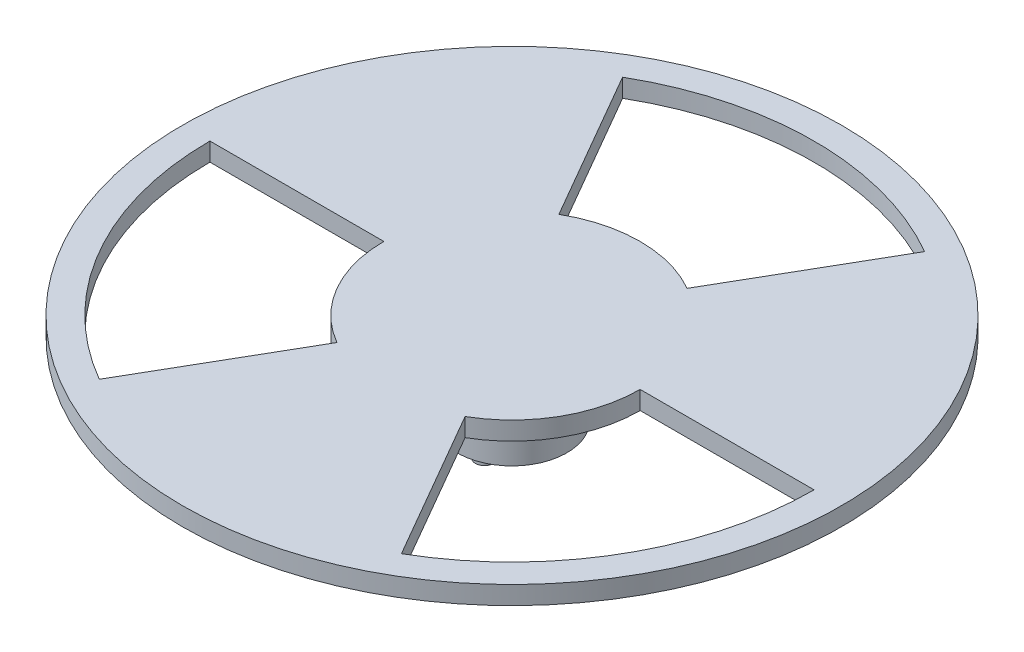
ISO-10303-21;
HEADER;
FILE_DESCRIPTION(('STEP AP214'),'2;1');
FILE_NAME('part.step','',(''),(''),'','','');
FILE_SCHEMA(('AUTOMOTIVE_DESIGN { 1 0 10303 214 1 1 1 1 }'));
ENDSEC;
DATA;
#1=APPLICATION_CONTEXT('core data for automotive mechanical design processes');
#2=APPLICATION_PROTOCOL_DEFINITION('international standard','automotive_design',2000,#1);
#3=PRODUCT_CONTEXT('',#1,'mechanical');
#4=PRODUCT('Part','Part','',(#3));
#5=PRODUCT_RELATED_PRODUCT_CATEGORY('part','',(#4));
#6=PRODUCT_DEFINITION_FORMATION('','',#4);
#7=PRODUCT_DEFINITION_CONTEXT('part definition',#1,'design');
#8=PRODUCT_DEFINITION('design','',#6,#7);
#9=PRODUCT_DEFINITION_SHAPE('','',#8);
#10=(LENGTH_UNIT() NAMED_UNIT(*) SI_UNIT(.MILLI.,.METRE.));
#11=(NAMED_UNIT(*) PLANE_ANGLE_UNIT() SI_UNIT($,.RADIAN.));
#12=(NAMED_UNIT(*) SI_UNIT($,.STERADIAN.) SOLID_ANGLE_UNIT());
#13=UNCERTAINTY_MEASURE_WITH_UNIT(LENGTH_MEASURE(1.E-05),#10,'distance_accuracy_value','');
#14=(GEOMETRIC_REPRESENTATION_CONTEXT(3) GLOBAL_UNCERTAINTY_ASSIGNED_CONTEXT((#13)) GLOBAL_UNIT_ASSIGNED_CONTEXT((#10,
#11,#12)) REPRESENTATION_CONTEXT('',''));
#15=CARTESIAN_POINT('',(0.,0.,0.));
#16=DIRECTION('',(0.,0.,1.));
#17=DIRECTION('',(1.,0.,0.));
#18=AXIS2_PLACEMENT_3D('',#15,#16,#17);
#19=CARTESIAN_POINT('',(0.,1.,0.));
#20=DIRECTION('',(0.,-1.,0.));
#21=DIRECTION('',(0.,0.,-1.));
#22=AXIS2_PLACEMENT_3D('',#19,#20,#21);
#23=CYLINDRICAL_SURFACE('',#22,18.);
#24=CARTESIAN_POINT('',(0.,1.,0.));
#25=DIRECTION('',(0.,1.,0.));
#26=DIRECTION('',(0.,0.,1.));
#27=AXIS2_PLACEMENT_3D('',#24,#25,#26);
#28=CIRCLE('',#27,18.);
#29=CARTESIAN_POINT('',(0.,1.,18.));
#30=VERTEX_POINT('',#29);
#31=EDGE_CURVE('E11',#30,#30,#28,.T.);
#32=ORIENTED_EDGE('',*,*,#31,.F.);
#33=EDGE_LOOP('',(#32));
#34=FACE_BOUND('',#33,.T.);
#35=CARTESIAN_POINT('',(0.,0.,0.));
#36=DIRECTION('',(0.,1.,0.));
#37=DIRECTION('',(0.,0.,1.));
#38=AXIS2_PLACEMENT_3D('',#35,#36,#37);
#39=CIRCLE('',#38,18.);
#40=CARTESIAN_POINT('',(0.,0.,18.));
#41=VERTEX_POINT('',#40);
#42=EDGE_CURVE('E45',#41,#41,#39,.T.);
#43=ORIENTED_EDGE('',*,*,#42,.T.);
#44=EDGE_LOOP('',(#43));
#45=FACE_BOUND('',#44,.T.);
#46=ADVANCED_FACE('F37',(#34,#45),#23,.T.);
#47=CARTESIAN_POINT('',(0.,1.,0.));
#48=DIRECTION('',(0.,1.,0.));
#49=DIRECTION('',(0.,0.,1.));
#50=AXIS2_PLACEMENT_3D('',#47,#48,#49);
#51=PLANE('',#50);
#52=CARTESIAN_POINT('',(0.,1.,0.));
#53=DIRECTION('',(0.,1.,0.));
#54=DIRECTION('',(0.,0.,-1.));
#55=AXIS2_PLACEMENT_3D('',#52,#53,#54);
#56=CIRCLE('',#55,16.5);
#57=CARTESIAN_POINT('',(8.25000000000002,1.,-14.2894191624432));
#58=VERTEX_POINT('',#57);
#59=CARTESIAN_POINT('',(-8.25000000000002,1.,-14.2894191624432));
#60=VERTEX_POINT('',#59);
#61=EDGE_CURVE('E53',#58,#60,#56,.T.);
#62=ORIENTED_EDGE('',*,*,#61,.F.);
#63=DIRECTION('',(0.500000000000001,0.,-0.866025403784438));
#64=VECTOR('',#63,1.);
#65=CARTESIAN_POINT('',(3.50000000000001,1.,-6.06217782649107));
#66=LINE('',#65,#64);
#67=CARTESIAN_POINT('',(3.50000000000001,1.,-6.06217782649107));
#68=VERTEX_POINT('',#67);
#69=EDGE_CURVE('E151',#68,#58,#66,.T.);
#70=ORIENTED_EDGE('',*,*,#69,.F.);
#71=CARTESIAN_POINT('',(0.,1.,0.));
#72=DIRECTION('',(0.,-1.,0.));
#73=DIRECTION('',(0.,0.,-1.));
#74=AXIS2_PLACEMENT_3D('',#71,#72,#73);
#75=CIRCLE('',#74,7.);
#76=CARTESIAN_POINT('',(-3.50000000000001,1.,-6.06217782649107));
#77=VERTEX_POINT('',#76);
#78=EDGE_CURVE('E134',#77,#68,#75,.T.);
#79=ORIENTED_EDGE('',*,*,#78,.F.);
#80=DIRECTION('',(0.500000000000001,0.,0.866025403784438));
#81=VECTOR('',#80,1.);
#82=CARTESIAN_POINT('',(-3.50000000000001,1.,-6.06217782649107));
#83=LINE('',#82,#81);
#84=EDGE_CURVE('E144',#60,#77,#83,.T.);
#85=ORIENTED_EDGE('',*,*,#84,.F.);
#86=EDGE_LOOP('',(#62,#70,#79,#85));
#87=FACE_BOUND('',#86,.T.);
#88=CARTESIAN_POINT('',(0.,1.,0.));
#89=DIRECTION('',(0.,1.,0.));
#90=DIRECTION('',(0.,0.,-1.));
#91=AXIS2_PLACEMENT_3D('',#88,#89,#90);
#92=CIRCLE('',#91,16.5);
#93=CARTESIAN_POINT('',(8.24999999999991,1.,14.2894191624433));
#94=VERTEX_POINT('',#93);
#95=CARTESIAN_POINT('',(16.5,1.,0.));
#96=VERTEX_POINT('',#95);
#97=EDGE_CURVE('E61',#94,#96,#92,.T.);
#98=ORIENTED_EDGE('',*,*,#97,.F.);
#99=DIRECTION('',(0.499999999999995,0.,0.866025403784442));
#100=VECTOR('',#99,1.);
#101=CARTESIAN_POINT('',(3.49999999999996,1.,6.06217782649109));
#102=LINE('',#101,#100);
#103=CARTESIAN_POINT('',(3.49999999999996,1.,6.06217782649109));
#104=VERTEX_POINT('',#103);
#105=EDGE_CURVE('E180',#104,#94,#102,.T.);
#106=ORIENTED_EDGE('',*,*,#105,.F.);
#107=CARTESIAN_POINT('',(0.,1.,0.));
#108=DIRECTION('',(0.,-1.,0.));
#109=DIRECTION('',(0.,0.,-1.));
#110=AXIS2_PLACEMENT_3D('',#107,#108,#109);
#111=CIRCLE('',#110,7.);
#112=CARTESIAN_POINT('',(7.,1.,0.));
#113=VERTEX_POINT('',#112);
#114=EDGE_CURVE('E177',#113,#104,#111,.T.);
#115=ORIENTED_EDGE('',*,*,#114,.F.);
#116=DIRECTION('',(-1.,0.,0.));
#117=VECTOR('',#116,1.);
#118=CARTESIAN_POINT('',(7.,1.,0.));
#119=LINE('',#118,#117);
#120=EDGE_CURVE('E173',#96,#113,#119,.T.);
#121=ORIENTED_EDGE('',*,*,#120,.F.);
#122=EDGE_LOOP('',(#98,#106,#115,#121));
#123=FACE_BOUND('',#122,.T.);
#124=CARTESIAN_POINT('',(0.,1.,0.));
#125=DIRECTION('',(0.,1.,0.));
#126=DIRECTION('',(0.,0.,-1.));
#127=AXIS2_PLACEMENT_3D('',#124,#125,#126);
#128=CIRCLE('',#127,16.5);
#129=CARTESIAN_POINT('',(-16.5,1.,-1.72604985859692E-13));
#130=VERTEX_POINT('',#129);
#131=CARTESIAN_POINT('',(-8.25000000000011,1.,14.2894191624432));
#132=VERTEX_POINT('',#131);
#133=EDGE_CURVE('E199',#130,#132,#128,.T.);
#134=ORIENTED_EDGE('',*,*,#133,.F.);
#135=DIRECTION('',(-1.,0.,0.));
#136=VECTOR('',#135,1.);
#137=CARTESIAN_POINT('',(-7.,1.,0.));
#138=LINE('',#137,#136);
#139=CARTESIAN_POINT('',(-7.,1.,0.));
#140=VERTEX_POINT('',#139);
#141=EDGE_CURVE('E207',#140,#130,#138,.T.);
#142=ORIENTED_EDGE('',*,*,#141,.F.);
#143=CARTESIAN_POINT('',(0.,1.,0.));
#144=DIRECTION('',(0.,-1.,0.));
#145=DIRECTION('',(0.,0.,-1.));
#146=AXIS2_PLACEMENT_3D('',#143,#144,#145);
#147=CIRCLE('',#146,7.);
#148=CARTESIAN_POINT('',(-3.50000000000005,1.,6.06217782649104));
#149=VERTEX_POINT('',#148);
#150=EDGE_CURVE('E204',#149,#140,#147,.T.);
#151=ORIENTED_EDGE('',*,*,#150,.F.);
#152=DIRECTION('',(0.500000000000007,0.,-0.866025403784435));
#153=VECTOR('',#152,1.);
#154=CARTESIAN_POINT('',(-3.50000000000005,1.,6.06217782649104));
#155=LINE('',#154,#153);
#156=EDGE_CURVE('E201',#132,#149,#155,.T.);
#157=ORIENTED_EDGE('',*,*,#156,.F.);
#158=EDGE_LOOP('',(#134,#142,#151,#157));
#159=FACE_BOUND('',#158,.T.);
#160=ORIENTED_EDGE('',*,*,#31,.T.);
#161=EDGE_LOOP('',(#160));
#162=FACE_BOUND('',#161,.T.);
#163=ADVANCED_FACE('F148',(#87,#123,#159,#162),#51,.T.);
#164=CARTESIAN_POINT('',(0.,0.,0.));
#165=DIRECTION('',(0.,1.,0.));
#166=DIRECTION('',(0.,0.,1.));
#167=AXIS2_PLACEMENT_3D('',#164,#165,#166);
#168=PLANE('',#167);
#169=CARTESIAN_POINT('',(0.,0.,0.));
#170=DIRECTION('',(0.,1.,0.));
#171=DIRECTION('',(0.,0.,1.));
#172=AXIS2_PLACEMENT_3D('',#169,#170,#171);
#173=CIRCLE('',#172,3.);
#174=CARTESIAN_POINT('',(0.,0.,3.));
#175=VERTEX_POINT('',#174);
#176=EDGE_CURVE('E40',#175,#175,#173,.T.);
#177=ORIENTED_EDGE('',*,*,#176,.T.);
#178=EDGE_LOOP('',(#177));
#179=FACE_BOUND('',#178,.T.);
#180=DIRECTION('',(-0.500000000000001,0.,0.866025403784438));
#181=VECTOR('',#180,1.);
#182=CARTESIAN_POINT('',(3.50000000000001,0.,-6.06217782649107));
#183=LINE('',#182,#181);
#184=CARTESIAN_POINT('',(8.25000000000002,0.,-14.2894191624432));
#185=VERTEX_POINT('',#184);
#186=CARTESIAN_POINT('',(3.50000000000001,0.,-6.06217782649107));
#187=VERTEX_POINT('',#186);
#188=EDGE_CURVE('E471',#185,#187,#183,.T.);
#189=ORIENTED_EDGE('',*,*,#188,.F.);
#190=CARTESIAN_POINT('',(0.,0.,0.));
#191=DIRECTION('',(0.,1.,0.));
#192=DIRECTION('',(0.,0.,1.));
#193=AXIS2_PLACEMENT_3D('',#190,#191,#192);
#194=CIRCLE('',#193,16.5);
#195=CARTESIAN_POINT('',(-8.25000000000002,0.,-14.2894191624432));
#196=VERTEX_POINT('',#195);
#197=EDGE_CURVE('E162',#196,#185,#194,.F.);
#198=ORIENTED_EDGE('',*,*,#197,.F.);
#199=DIRECTION('',(-0.500000000000001,0.,-0.866025403784438));
#200=VECTOR('',#199,1.);
#201=CARTESIAN_POINT('',(-3.50000000000001,0.,-6.06217782649107));
#202=LINE('',#201,#200);
#203=CARTESIAN_POINT('',(-3.50000000000001,0.,-6.06217782649107));
#204=VERTEX_POINT('',#203);
#205=EDGE_CURVE('E160',#204,#196,#202,.T.);
#206=ORIENTED_EDGE('',*,*,#205,.F.);
#207=CARTESIAN_POINT('',(0.,0.,0.));
#208=DIRECTION('',(0.,1.,0.));
#209=DIRECTION('',(0.,0.,1.));
#210=AXIS2_PLACEMENT_3D('',#207,#208,#209);
#211=CIRCLE('',#210,7.);
#212=EDGE_CURVE('E137',#187,#204,#211,.T.);
#213=ORIENTED_EDGE('',*,*,#212,.F.);
#214=EDGE_LOOP('',(#189,#198,#206,#213));
#215=FACE_BOUND('',#214,.T.);
#216=DIRECTION('',(-0.499999999999995,0.,-0.866025403784442));
#217=VECTOR('',#216,1.);
#218=CARTESIAN_POINT('',(3.49999999999996,0.,6.06217782649109));
#219=LINE('',#218,#217);
#220=CARTESIAN_POINT('',(8.24999999999991,0.,14.2894191624433));
#221=VERTEX_POINT('',#220);
#222=CARTESIAN_POINT('',(3.49999999999996,0.,6.06217782649109));
#223=VERTEX_POINT('',#222);
#224=EDGE_CURVE('E166',#221,#223,#219,.T.);
#225=ORIENTED_EDGE('',*,*,#224,.F.);
#226=CARTESIAN_POINT('',(0.,0.,0.));
#227=DIRECTION('',(0.,1.,0.));
#228=DIRECTION('',(0.,0.,1.));
#229=AXIS2_PLACEMENT_3D('',#226,#227,#228);
#230=CIRCLE('',#229,16.5);
#231=CARTESIAN_POINT('',(16.5,0.,0.));
#232=VERTEX_POINT('',#231);
#233=EDGE_CURVE('E169',#232,#221,#230,.F.);
#234=ORIENTED_EDGE('',*,*,#233,.F.);
#235=DIRECTION('',(1.,0.,0.));
#236=VECTOR('',#235,1.);
#237=CARTESIAN_POINT('',(7.,0.,0.));
#238=LINE('',#237,#236);
#239=CARTESIAN_POINT('',(7.,0.,0.));
#240=VERTEX_POINT('',#239);
#241=EDGE_CURVE('E171',#240,#232,#238,.T.);
#242=ORIENTED_EDGE('',*,*,#241,.F.);
#243=CARTESIAN_POINT('',(0.,0.,0.));
#244=DIRECTION('',(0.,1.,0.));
#245=DIRECTION('',(0.,0.,1.));
#246=AXIS2_PLACEMENT_3D('',#243,#244,#245);
#247=CIRCLE('',#246,7.);
#248=EDGE_CURVE('E163',#223,#240,#247,.T.);
#249=ORIENTED_EDGE('',*,*,#248,.F.);
#250=EDGE_LOOP('',(#225,#234,#242,#249));
#251=FACE_BOUND('',#250,.T.);
#252=DIRECTION('',(1.,0.,0.));
#253=VECTOR('',#252,1.);
#254=CARTESIAN_POINT('',(-7.,0.,0.));
#255=LINE('',#254,#253);
#256=CARTESIAN_POINT('',(-16.5,0.,-1.72604985859692E-13));
#257=VERTEX_POINT('',#256);
#258=CARTESIAN_POINT('',(-7.,0.,0.));
#259=VERTEX_POINT('',#258);
#260=EDGE_CURVE('E194',#257,#259,#255,.T.);
#261=ORIENTED_EDGE('',*,*,#260,.F.);
#262=CARTESIAN_POINT('',(0.,0.,0.));
#263=DIRECTION('',(0.,1.,0.));
#264=DIRECTION('',(0.,0.,1.));
#265=AXIS2_PLACEMENT_3D('',#262,#263,#264);
#266=CIRCLE('',#265,16.5);
#267=CARTESIAN_POINT('',(-8.25000000000011,0.,14.2894191624432));
#268=VERTEX_POINT('',#267);
#269=EDGE_CURVE('E197',#268,#257,#266,.F.);
#270=ORIENTED_EDGE('',*,*,#269,.F.);
#271=DIRECTION('',(-0.500000000000007,0.,0.866025403784435));
#272=VECTOR('',#271,1.);
#273=CARTESIAN_POINT('',(-3.50000000000005,0.,6.06217782649104));
#274=LINE('',#273,#272);
#275=CARTESIAN_POINT('',(-3.50000000000005,0.,6.06217782649104));
#276=VERTEX_POINT('',#275);
#277=EDGE_CURVE('E174',#276,#268,#274,.T.);
#278=ORIENTED_EDGE('',*,*,#277,.F.);
#279=CARTESIAN_POINT('',(0.,0.,0.));
#280=DIRECTION('',(0.,1.,0.));
#281=DIRECTION('',(0.,0.,1.));
#282=AXIS2_PLACEMENT_3D('',#279,#280,#281);
#283=CIRCLE('',#282,7.);
#284=EDGE_CURVE('E191',#259,#276,#283,.T.);
#285=ORIENTED_EDGE('',*,*,#284,.F.);
#286=EDGE_LOOP('',(#261,#270,#278,#285));
#287=FACE_BOUND('',#286,.T.);
#288=ORIENTED_EDGE('',*,*,#42,.F.);
#289=EDGE_LOOP('',(#288));
#290=FACE_BOUND('',#289,.T.);
#291=ADVANCED_FACE('F222',(#179,#215,#251,#287,#290),#168,.F.);
#292=CARTESIAN_POINT('',(0.,-19.5242959341892,0.));
#293=DIRECTION('',(0.,1.,0.));
#294=DIRECTION('',(0.,0.,1.));
#295=AXIS2_PLACEMENT_3D('',#292,#293,#294);
#296=CYLINDRICAL_SURFACE('',#295,16.5);
#297=ORIENTED_EDGE('',*,*,#269,.T.);
#298=DIRECTION('',(0.,1.,0.));
#299=VECTOR('',#298,1.);
#300=CARTESIAN_POINT('',(-16.5,-19.5242959341892,-1.72604985859692E-13));
#301=LINE('',#300,#299);
#302=EDGE_CURVE('E195',#257,#130,#301,.T.);
#303=ORIENTED_EDGE('',*,*,#302,.T.);
#304=ORIENTED_EDGE('',*,*,#133,.T.);
#305=DIRECTION('',(0.,1.,0.));
#306=VECTOR('',#305,1.);
#307=CARTESIAN_POINT('',(-8.25000000000011,-19.5242959341892,14.2894191624432));
#308=LINE('',#307,#306);
#309=EDGE_CURVE('E210',#268,#132,#308,.T.);
#310=ORIENTED_EDGE('',*,*,#309,.F.);
#311=EDGE_LOOP('',(#297,#303,#304,#310));
#312=FACE_BOUND('',#311,.T.);
#313=ADVANCED_FACE('F224',(#312),#296,.F.);
#314=CARTESIAN_POINT('',(-7.,-19.5242959341892,0.));
#315=DIRECTION('',(0.,0.,-1.));
#316=DIRECTION('',(-1.,0.,0.));
#317=AXIS2_PLACEMENT_3D('',#314,#315,#316);
#318=PLANE('',#317);
#319=ORIENTED_EDGE('',*,*,#260,.T.);
#320=DIRECTION('',(0.,1.,0.));
#321=VECTOR('',#320,1.);
#322=CARTESIAN_POINT('',(-7.,-19.5242959341892,0.));
#323=LINE('',#322,#321);
#324=EDGE_CURVE('E212',#259,#140,#323,.T.);
#325=ORIENTED_EDGE('',*,*,#324,.T.);
#326=ORIENTED_EDGE('',*,*,#141,.T.);
#327=ORIENTED_EDGE('',*,*,#302,.F.);
#328=EDGE_LOOP('',(#319,#325,#326,#327));
#329=FACE_BOUND('',#328,.T.);
#330=ADVANCED_FACE('F230',(#329),#318,.F.);
#331=CARTESIAN_POINT('',(0.,-19.5242959341892,0.));
#332=DIRECTION('',(0.,1.,0.));
#333=DIRECTION('',(0.,0.,1.));
#334=AXIS2_PLACEMENT_3D('',#331,#332,#333);
#335=CYLINDRICAL_SURFACE('',#334,7.);
#336=ORIENTED_EDGE('',*,*,#284,.T.);
#337=DIRECTION('',(0.,1.,0.));
#338=VECTOR('',#337,1.);
#339=CARTESIAN_POINT('',(-3.50000000000005,-19.5242959341892,6.06217782649104));
#340=LINE('',#339,#338);
#341=EDGE_CURVE('E214',#276,#149,#340,.T.);
#342=ORIENTED_EDGE('',*,*,#341,.T.);
#343=ORIENTED_EDGE('',*,*,#150,.T.);
#344=ORIENTED_EDGE('',*,*,#324,.F.);
#345=EDGE_LOOP('',(#336,#342,#343,#344));
#346=FACE_BOUND('',#345,.T.);
#347=ADVANCED_FACE('F372',(#346),#335,.T.);
#348=CARTESIAN_POINT('',(-3.50000000000005,-19.5242959341892,6.06217782649104));
#349=DIRECTION('',(0.866025403784435,0.,0.500000000000007));
#350=DIRECTION('',(0.500000000000007,0.,-0.866025403784435));
#351=AXIS2_PLACEMENT_3D('',#348,#349,#350);
#352=PLANE('',#351);
#353=ORIENTED_EDGE('',*,*,#277,.T.);
#354=ORIENTED_EDGE('',*,*,#309,.T.);
#355=ORIENTED_EDGE('',*,*,#156,.T.);
#356=ORIENTED_EDGE('',*,*,#341,.F.);
#357=EDGE_LOOP('',(#353,#354,#355,#356));
#358=FACE_BOUND('',#357,.T.);
#359=ADVANCED_FACE('F369',(#358),#352,.F.);
#360=CARTESIAN_POINT('',(0.,-19.5242959341892,0.));
#361=DIRECTION('',(0.,1.,0.));
#362=DIRECTION('',(0.,0.,1.));
#363=AXIS2_PLACEMENT_3D('',#360,#361,#362);
#364=CYLINDRICAL_SURFACE('',#363,16.5);
#365=ORIENTED_EDGE('',*,*,#233,.T.);
#366=DIRECTION('',(0.,1.,0.));
#367=VECTOR('',#366,1.);
#368=CARTESIAN_POINT('',(8.24999999999991,-19.5242959341892,14.2894191624433));
#369=LINE('',#368,#367);
#370=EDGE_CURVE('E167',#221,#94,#369,.T.);
#371=ORIENTED_EDGE('',*,*,#370,.T.);
#372=ORIENTED_EDGE('',*,*,#97,.T.);
#373=DIRECTION('',(0.,1.,0.));
#374=VECTOR('',#373,1.);
#375=CARTESIAN_POINT('',(16.5,-19.5242959341892,0.));
#376=LINE('',#375,#374);
#377=EDGE_CURVE('E183',#232,#96,#376,.T.);
#378=ORIENTED_EDGE('',*,*,#377,.F.);
#379=EDGE_LOOP('',(#365,#371,#372,#378));
#380=FACE_BOUND('',#379,.T.);
#381=ADVANCED_FACE('F359',(#380),#364,.F.);
#382=CARTESIAN_POINT('',(3.49999999999996,-19.5242959341892,6.06217782649109));
#383=DIRECTION('',(-0.866025403784442,0.,0.499999999999995));
#384=DIRECTION('',(0.499999999999995,0.,0.866025403784442));
#385=AXIS2_PLACEMENT_3D('',#382,#383,#384);
#386=PLANE('',#385);
#387=ORIENTED_EDGE('',*,*,#224,.T.);
#388=DIRECTION('',(0.,1.,0.));
#389=VECTOR('',#388,1.);
#390=CARTESIAN_POINT('',(3.49999999999996,-19.5242959341892,6.06217782649109));
#391=LINE('',#390,#389);
#392=EDGE_CURVE('E185',#223,#104,#391,.T.);
#393=ORIENTED_EDGE('',*,*,#392,.T.);
#394=ORIENTED_EDGE('',*,*,#105,.T.);
#395=ORIENTED_EDGE('',*,*,#370,.F.);
#396=EDGE_LOOP('',(#387,#393,#394,#395));
#397=FACE_BOUND('',#396,.T.);
#398=ADVANCED_FACE('F355',(#397),#386,.F.);
#399=CARTESIAN_POINT('',(0.,-19.5242959341892,0.));
#400=DIRECTION('',(0.,1.,0.));
#401=DIRECTION('',(0.,0.,1.));
#402=AXIS2_PLACEMENT_3D('',#399,#400,#401);
#403=CYLINDRICAL_SURFACE('',#402,7.);
#404=ORIENTED_EDGE('',*,*,#248,.T.);
#405=DIRECTION('',(0.,1.,0.));
#406=VECTOR('',#405,1.);
#407=CARTESIAN_POINT('',(7.,-19.5242959341892,0.));
#408=LINE('',#407,#406);
#409=EDGE_CURVE('E187',#240,#113,#408,.T.);
#410=ORIENTED_EDGE('',*,*,#409,.T.);
#411=ORIENTED_EDGE('',*,*,#114,.T.);
#412=ORIENTED_EDGE('',*,*,#392,.F.);
#413=EDGE_LOOP('',(#404,#410,#411,#412));
#414=FACE_BOUND('',#413,.T.);
#415=ADVANCED_FACE('F358',(#414),#403,.T.);
#416=CARTESIAN_POINT('',(7.,-19.5242959341892,0.));
#417=DIRECTION('',(0.,0.,-1.));
#418=DIRECTION('',(-1.,0.,0.));
#419=AXIS2_PLACEMENT_3D('',#416,#417,#418);
#420=PLANE('',#419);
#421=ORIENTED_EDGE('',*,*,#241,.T.);
#422=ORIENTED_EDGE('',*,*,#377,.T.);
#423=ORIENTED_EDGE('',*,*,#120,.T.);
#424=ORIENTED_EDGE('',*,*,#409,.F.);
#425=EDGE_LOOP('',(#421,#422,#423,#424));
#426=FACE_BOUND('',#425,.T.);
#427=ADVANCED_FACE('F354',(#426),#420,.F.);
#428=CARTESIAN_POINT('',(0.,-19.5242959341892,0.));
#429=DIRECTION('',(0.,1.,0.));
#430=DIRECTION('',(0.,0.,1.));
#431=AXIS2_PLACEMENT_3D('',#428,#429,#430);
#432=CYLINDRICAL_SURFACE('',#431,16.5);
#433=ORIENTED_EDGE('',*,*,#197,.T.);
#434=DIRECTION('',(0.,1.,0.));
#435=VECTOR('',#434,1.);
#436=CARTESIAN_POINT('',(8.25000000000002,-19.5242959341892,-14.2894191624432));
#437=LINE('',#436,#435);
#438=EDGE_CURVE('E156',#185,#58,#437,.T.);
#439=ORIENTED_EDGE('',*,*,#438,.T.);
#440=ORIENTED_EDGE('',*,*,#61,.T.);
#441=DIRECTION('',(0.,1.,0.));
#442=VECTOR('',#441,1.);
#443=CARTESIAN_POINT('',(-8.25000000000002,-19.5242959341892,-14.2894191624432));
#444=LINE('',#443,#442);
#445=EDGE_CURVE('E141',#196,#60,#444,.T.);
#446=ORIENTED_EDGE('',*,*,#445,.F.);
#447=EDGE_LOOP('',(#433,#439,#440,#446));
#448=FACE_BOUND('',#447,.T.);
#449=ADVANCED_FACE('F347',(#448),#432,.F.);
#450=CARTESIAN_POINT('',(3.50000000000001,-19.5242959341892,-6.06217782649107));
#451=DIRECTION('',(0.866025403784438,0.,0.500000000000001));
#452=DIRECTION('',(0.500000000000001,0.,-0.866025403784438));
#453=AXIS2_PLACEMENT_3D('',#450,#451,#452);
#454=PLANE('',#453);
#455=ORIENTED_EDGE('',*,*,#188,.T.);
#456=DIRECTION('',(0.,1.,0.));
#457=VECTOR('',#456,1.);
#458=CARTESIAN_POINT('',(3.50000000000001,-19.5242959341892,-6.06217782649107));
#459=LINE('',#458,#457);
#460=EDGE_CURVE('E140',#187,#68,#459,.T.);
#461=ORIENTED_EDGE('',*,*,#460,.T.);
#462=ORIENTED_EDGE('',*,*,#69,.T.);
#463=ORIENTED_EDGE('',*,*,#438,.F.);
#464=EDGE_LOOP('',(#455,#461,#462,#463));
#465=FACE_BOUND('',#464,.T.);
#466=ADVANCED_FACE('F344',(#465),#454,.F.);
#467=CARTESIAN_POINT('',(0.,-19.5242959341892,0.));
#468=DIRECTION('',(0.,1.,0.));
#469=DIRECTION('',(0.,0.,1.));
#470=AXIS2_PLACEMENT_3D('',#467,#468,#469);
#471=CYLINDRICAL_SURFACE('',#470,7.);
#472=ORIENTED_EDGE('',*,*,#212,.T.);
#473=DIRECTION('',(0.,1.,0.));
#474=VECTOR('',#473,1.);
#475=CARTESIAN_POINT('',(-3.50000000000001,-19.5242959341892,-6.06217782649107));
#476=LINE('',#475,#474);
#477=EDGE_CURVE('E129',#204,#77,#476,.T.);
#478=ORIENTED_EDGE('',*,*,#477,.T.);
#479=ORIENTED_EDGE('',*,*,#78,.T.);
#480=ORIENTED_EDGE('',*,*,#460,.F.);
#481=EDGE_LOOP('',(#472,#478,#479,#480));
#482=FACE_BOUND('',#481,.T.);
#483=ADVANCED_FACE('F131',(#482),#471,.T.);
#484=CARTESIAN_POINT('',(-3.50000000000001,-19.5242959341892,-6.06217782649107));
#485=DIRECTION('',(-0.866025403784438,0.,0.500000000000001));
#486=DIRECTION('',(0.500000000000001,0.,0.866025403784438));
#487=AXIS2_PLACEMENT_3D('',#484,#485,#486);
#488=PLANE('',#487);
#489=ORIENTED_EDGE('',*,*,#205,.T.);
#490=ORIENTED_EDGE('',*,*,#445,.T.);
#491=ORIENTED_EDGE('',*,*,#84,.T.);
#492=ORIENTED_EDGE('',*,*,#477,.F.);
#493=EDGE_LOOP('',(#489,#490,#491,#492));
#494=FACE_BOUND('',#493,.T.);
#495=ADVANCED_FACE('F145',(#494),#488,.F.);
#496=CARTESIAN_POINT('',(0.,9.48528137423857,0.));
#497=DIRECTION('',(0.,-1.,0.));
#498=DIRECTION('',(0.,0.,-1.));
#499=AXIS2_PLACEMENT_3D('',#496,#497,#498);
#500=CYLINDRICAL_SURFACE('',#499,3.);
#501=CARTESIAN_POINT('',(0.,-4.,0.));
#502=DIRECTION('',(0.,-1.,0.));
#503=DIRECTION('',(0.,0.,-1.));
#504=AXIS2_PLACEMENT_3D('',#501,#502,#503);
#505=CIRCLE('',#504,3.);
#506=CARTESIAN_POINT('',(0.,-4.,-3.));
#507=VERTEX_POINT('',#506);
#508=EDGE_CURVE('E476',#507,#507,#505,.T.);
#509=ORIENTED_EDGE('',*,*,#508,.F.);
#510=EDGE_LOOP('',(#509));
#511=FACE_BOUND('',#510,.T.);
#512=ORIENTED_EDGE('',*,*,#176,.F.);
#513=EDGE_LOOP('',(#512));
#514=FACE_BOUND('',#513,.T.);
#515=ADVANCED_FACE('F264',(#511,#514),#500,.T.);
#516=CARTESIAN_POINT('',(0.,-4.,0.));
#517=DIRECTION('',(0.,-1.,0.));
#518=DIRECTION('',(0.,0.,-1.));
#519=AXIS2_PLACEMENT_3D('',#516,#517,#518);
#520=PLANE('',#519);
#521=CARTESIAN_POINT('',(1.29903810567665,-4.,-0.750000000000006));
#522=DIRECTION('',(0.,-1.,0.));
#523=DIRECTION('',(0.,0.,-1.));
#524=AXIS2_PLACEMENT_3D('',#521,#522,#523);
#525=CIRCLE('',#524,0.5);
#526=CARTESIAN_POINT('',(1.29903810567665,-4.,-1.25000000000001));
#527=VERTEX_POINT('',#526);
#528=EDGE_CURVE('E489',#527,#527,#525,.T.);
#529=ORIENTED_EDGE('',*,*,#528,.F.);
#530=EDGE_LOOP('',(#529));
#531=FACE_BOUND('',#530,.T.);
#532=CARTESIAN_POINT('',(-1.29903810567667,-4.,-0.75));
#533=DIRECTION('',(0.,-1.,0.));
#534=DIRECTION('',(0.,0.,-1.));
#535=AXIS2_PLACEMENT_3D('',#532,#533,#534);
#536=CIRCLE('',#535,0.5);
#537=CARTESIAN_POINT('',(-1.29903810567667,-4.,-1.25));
#538=VERTEX_POINT('',#537);
#539=EDGE_CURVE('E483',#538,#538,#536,.T.);
#540=ORIENTED_EDGE('',*,*,#539,.F.);
#541=EDGE_LOOP('',(#540));
#542=FACE_BOUND('',#541,.T.);
#543=CARTESIAN_POINT('',(0.,-4.,1.5));
#544=DIRECTION('',(0.,-1.,0.));
#545=DIRECTION('',(0.,0.,-1.));
#546=AXIS2_PLACEMENT_3D('',#543,#544,#545);
#547=CIRCLE('',#546,0.5);
#548=CARTESIAN_POINT('',(0.,-4.,1.));
#549=VERTEX_POINT('',#548);
#550=EDGE_CURVE('E480',#549,#549,#547,.T.);
#551=ORIENTED_EDGE('',*,*,#550,.F.);
#552=EDGE_LOOP('',(#551));
#553=FACE_BOUND('',#552,.T.);
#554=ORIENTED_EDGE('',*,*,#508,.T.);
#555=EDGE_LOOP('',(#554));
#556=FACE_BOUND('',#555,.T.);
#557=ADVANCED_FACE('F268',(#531,#542,#553,#556),#520,.T.);
#558=CARTESIAN_POINT('',(0.,-5.,1.5));
#559=DIRECTION('',(0.,1.,0.));
#560=DIRECTION('',(0.,0.,1.));
#561=AXIS2_PLACEMENT_3D('',#558,#559,#560);
#562=CYLINDRICAL_SURFACE('',#561,0.5);
#563=CARTESIAN_POINT('',(0.,-5.,1.5));
#564=DIRECTION('',(0.,-1.,0.));
#565=DIRECTION('',(0.,0.,-1.));
#566=AXIS2_PLACEMENT_3D('',#563,#564,#565);
#567=CIRCLE('',#566,0.5);
#568=CARTESIAN_POINT('',(0.,-5.,1.));
#569=VERTEX_POINT('',#568);
#570=EDGE_CURVE('E479',#569,#569,#567,.T.);
#571=ORIENTED_EDGE('',*,*,#570,.F.);
#572=EDGE_LOOP('',(#571));
#573=FACE_BOUND('',#572,.T.);
#574=ORIENTED_EDGE('',*,*,#550,.T.);
#575=EDGE_LOOP('',(#574));
#576=FACE_BOUND('',#575,.T.);
#577=ADVANCED_FACE('F278',(#573,#576),#562,.T.);
#578=CARTESIAN_POINT('',(0.,-5.,1.5));
#579=DIRECTION('',(0.,-1.,0.));
#580=DIRECTION('',(0.,0.,-1.));
#581=AXIS2_PLACEMENT_3D('',#578,#579,#580);
#582=PLANE('',#581);
#583=ORIENTED_EDGE('',*,*,#570,.T.);
#584=EDGE_LOOP('',(#583));
#585=FACE_BOUND('',#584,.T.);
#586=ADVANCED_FACE('F288',(#585),#582,.T.);
#587=CARTESIAN_POINT('',(-1.29903810567667,-5.,-0.75));
#588=DIRECTION('',(0.,1.,0.));
#589=DIRECTION('',(0.,0.,1.));
#590=AXIS2_PLACEMENT_3D('',#587,#588,#589);
#591=CYLINDRICAL_SURFACE('',#590,0.5);
#592=CARTESIAN_POINT('',(-1.29903810567667,-5.,-0.75));
#593=DIRECTION('',(0.,-1.,0.));
#594=DIRECTION('',(0.,0.,-1.));
#595=AXIS2_PLACEMENT_3D('',#592,#593,#594);
#596=CIRCLE('',#595,0.5);
#597=CARTESIAN_POINT('',(-1.29903810567667,-5.,-1.25));
#598=VERTEX_POINT('',#597);
#599=EDGE_CURVE('E486',#598,#598,#596,.T.);
#600=ORIENTED_EDGE('',*,*,#599,.F.);
#601=EDGE_LOOP('',(#600));
#602=FACE_BOUND('',#601,.T.);
#603=ORIENTED_EDGE('',*,*,#539,.T.);
#604=EDGE_LOOP('',(#603));
#605=FACE_BOUND('',#604,.T.);
#606=ADVANCED_FACE('F298',(#602,#605),#591,.T.);
#607=CARTESIAN_POINT('',(-1.29903810567667,-5.,-0.75));
#608=DIRECTION('',(0.,-1.,0.));
#609=DIRECTION('',(0.,0.,-1.));
#610=AXIS2_PLACEMENT_3D('',#607,#608,#609);
#611=PLANE('',#610);
#612=ORIENTED_EDGE('',*,*,#599,.T.);
#613=EDGE_LOOP('',(#612));
#614=FACE_BOUND('',#613,.T.);
#615=ADVANCED_FACE('F308',(#614),#611,.T.);
#616=CARTESIAN_POINT('',(1.29903810567665,-5.,-0.750000000000006));
#617=DIRECTION('',(0.,1.,0.));
#618=DIRECTION('',(0.,0.,1.));
#619=AXIS2_PLACEMENT_3D('',#616,#617,#618);
#620=CYLINDRICAL_SURFACE('',#619,0.5);
#621=CARTESIAN_POINT('',(1.29903810567665,-5.,-0.750000000000006));
#622=DIRECTION('',(0.,-1.,0.));
#623=DIRECTION('',(0.,0.,-1.));
#624=AXIS2_PLACEMENT_3D('',#621,#622,#623);
#625=CIRCLE('',#624,0.5);
#626=CARTESIAN_POINT('',(1.29903810567665,-5.,-1.25000000000001));
#627=VERTEX_POINT('',#626);
#628=EDGE_CURVE('E492',#627,#627,#625,.T.);
#629=ORIENTED_EDGE('',*,*,#628,.F.);
#630=EDGE_LOOP('',(#629));
#631=FACE_BOUND('',#630,.T.);
#632=ORIENTED_EDGE('',*,*,#528,.T.);
#633=EDGE_LOOP('',(#632));
#634=FACE_BOUND('',#633,.T.);
#635=ADVANCED_FACE('F318',(#631,#634),#620,.T.);
#636=CARTESIAN_POINT('',(1.29903810567665,-5.,-0.750000000000006));
#637=DIRECTION('',(0.,-1.,0.));
#638=DIRECTION('',(0.,0.,-1.));
#639=AXIS2_PLACEMENT_3D('',#636,#637,#638);
#640=PLANE('',#639);
#641=ORIENTED_EDGE('',*,*,#628,.T.);
#642=EDGE_LOOP('',(#641));
#643=FACE_BOUND('',#642,.T.);
#644=ADVANCED_FACE('F328',(#643),#640,.T.);
#645=CLOSED_SHELL('',(#46,#163,#291,#313,#330,#347,#359,#381,#398,#415,#427,#449,#466,#483,#495,
#515,#557,#577,#586,#606,#615,#635,#644));
#646=MANIFOLD_SOLID_BREP('B2',#645);
#647=ADVANCED_BREP_SHAPE_REPRESENTATION('',(#18,#646),#14);
#648=SHAPE_DEFINITION_REPRESENTATION(#9,#647);
ENDSEC;
END-ISO-10303-21;
